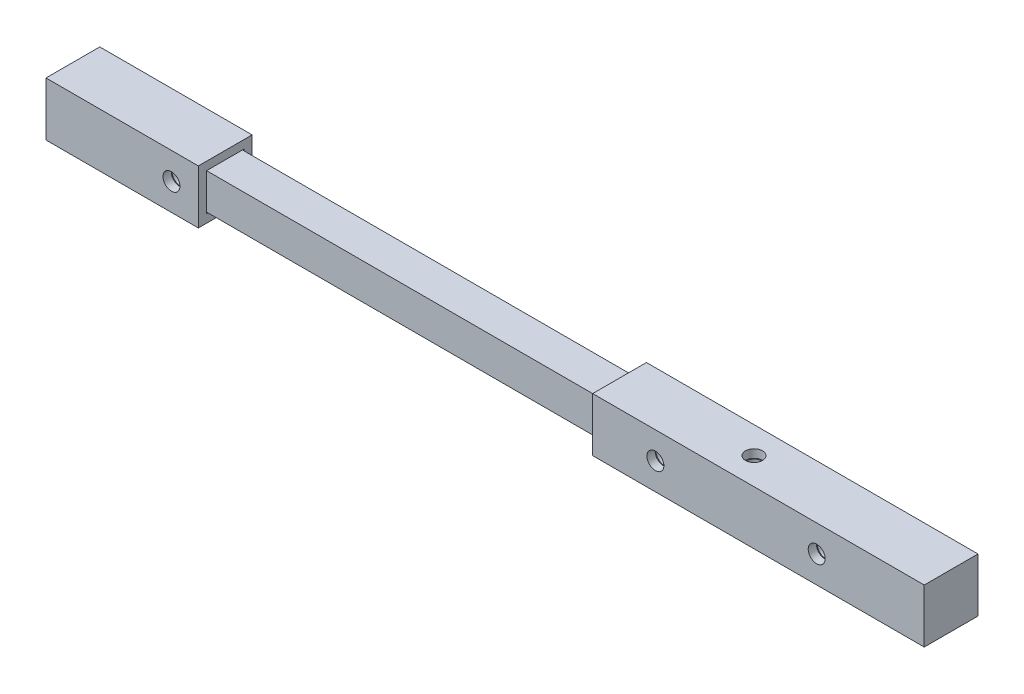
ISO-10303-21;
HEADER;
FILE_DESCRIPTION(('STEP AP214'),'2;1');
FILE_NAME('part.step','',(''),(''),'','','');
FILE_SCHEMA(('AUTOMOTIVE_DESIGN { 1 0 10303 214 1 1 1 1 }'));
ENDSEC;
DATA;
#1=APPLICATION_CONTEXT('core data for automotive mechanical design processes');
#2=APPLICATION_PROTOCOL_DEFINITION('international standard','automotive_design',2000,#1);
#3=PRODUCT_CONTEXT('',#1,'mechanical');
#4=PRODUCT('Part','Part','',(#3));
#5=PRODUCT_RELATED_PRODUCT_CATEGORY('part','',(#4));
#6=PRODUCT_DEFINITION_FORMATION('','',#4);
#7=PRODUCT_DEFINITION_CONTEXT('part definition',#1,'design');
#8=PRODUCT_DEFINITION('design','',#6,#7);
#9=PRODUCT_DEFINITION_SHAPE('','',#8);
#10=(LENGTH_UNIT() NAMED_UNIT(*) SI_UNIT(.MILLI.,.METRE.));
#11=(NAMED_UNIT(*) PLANE_ANGLE_UNIT() SI_UNIT($,.RADIAN.));
#12=(NAMED_UNIT(*) SI_UNIT($,.STERADIAN.) SOLID_ANGLE_UNIT());
#13=UNCERTAINTY_MEASURE_WITH_UNIT(LENGTH_MEASURE(1.E-05),#10,'distance_accuracy_value','');
#14=(GEOMETRIC_REPRESENTATION_CONTEXT(3) GLOBAL_UNCERTAINTY_ASSIGNED_CONTEXT((#13)) GLOBAL_UNIT_ASSIGNED_CONTEXT((#10,
#11,#12)) REPRESENTATION_CONTEXT('',''));
#15=CARTESIAN_POINT('',(0.,0.,0.));
#16=DIRECTION('',(0.,0.,1.));
#17=DIRECTION('',(1.,0.,0.));
#18=AXIS2_PLACEMENT_3D('',#15,#16,#17);
#19=CARTESIAN_POINT('',(25.4,-4.7625,-4.7625));
#20=DIRECTION('',(0.,-1.,0.));
#21=DIRECTION('',(0.,0.,-1.));
#22=AXIS2_PLACEMENT_3D('',#19,#20,#21);
#23=PLANE('',#22);
#24=DIRECTION('',(-1.,0.,0.));
#25=VECTOR('',#24,1.);
#26=CARTESIAN_POINT('',(25.4,-4.7625,4.7625));
#27=LINE('',#26,#25);
#28=CARTESIAN_POINT('',(25.4,-4.7625,4.7625));
#29=VERTEX_POINT('',#28);
#30=CARTESIAN_POINT('',(-1.5875,-4.7625,4.7625));
#31=VERTEX_POINT('',#30);
#32=EDGE_CURVE('E133',#29,#31,#27,.T.);
#33=ORIENTED_EDGE('',*,*,#32,.T.);
#34=DIRECTION('',(0.,0.,1.));
#35=VECTOR('',#34,1.);
#36=CARTESIAN_POINT('',(-1.5875,-4.7625,-4.7625));
#37=LINE('',#36,#35);
#38=CARTESIAN_POINT('',(-1.5875,-4.7625,-4.7625));
#39=VERTEX_POINT('',#38);
#40=EDGE_CURVE('E128',#39,#31,#37,.T.);
#41=ORIENTED_EDGE('',*,*,#40,.F.);
#42=DIRECTION('',(-1.,0.,0.));
#43=VECTOR('',#42,1.);
#44=CARTESIAN_POINT('',(25.4,-4.7625,-4.7625));
#45=LINE('',#44,#43);
#46=CARTESIAN_POINT('',(25.4,-4.7625,-4.7625));
#47=VERTEX_POINT('',#46);
#48=EDGE_CURVE('E12',#47,#39,#45,.T.);
#49=ORIENTED_EDGE('',*,*,#48,.F.);
#50=DIRECTION('',(0.,0.,1.));
#51=VECTOR('',#50,1.);
#52=CARTESIAN_POINT('',(25.4,-4.7625,-4.7625));
#53=LINE('',#52,#51);
#54=EDGE_CURVE('E172',#47,#29,#53,.T.);
#55=ORIENTED_EDGE('',*,*,#54,.T.);
#56=EDGE_LOOP('',(#33,#41,#49,#55));
#57=FACE_BOUND('',#56,.T.);
#58=ADVANCED_FACE('F59',(#57),#23,.T.);
#59=CARTESIAN_POINT('',(25.4,4.7625,-4.7625));
#60=DIRECTION('',(0.,0.,-1.));
#61=DIRECTION('',(-1.,0.,0.));
#62=AXIS2_PLACEMENT_3D('',#59,#60,#61);
#63=PLANE('',#62);
#64=CARTESIAN_POINT('',(20.6375,0.,-4.7625));
#65=DIRECTION('',(0.,0.,1.));
#66=DIRECTION('',(1.,0.,0.));
#67=AXIS2_PLACEMENT_3D('',#64,#65,#66);
#68=CIRCLE('',#67,1.5);
#69=CARTESIAN_POINT('',(22.1375,0.,-4.7625));
#70=VERTEX_POINT('',#69);
#71=EDGE_CURVE('E228',#70,#70,#68,.T.);
#72=ORIENTED_EDGE('',*,*,#71,.T.);
#73=EDGE_LOOP('',(#72));
#74=FACE_BOUND('',#73,.T.);
#75=ORIENTED_EDGE('',*,*,#48,.T.);
#76=DIRECTION('',(0.,-1.,0.));
#77=VECTOR('',#76,1.);
#78=CARTESIAN_POINT('',(-1.5875,4.7625,-4.7625));
#79=LINE('',#78,#77);
#80=CARTESIAN_POINT('',(-1.5875,4.7625,-4.7625));
#81=VERTEX_POINT('',#80);
#82=EDGE_CURVE('E127',#81,#39,#79,.T.);
#83=ORIENTED_EDGE('',*,*,#82,.F.);
#84=DIRECTION('',(-1.,0.,0.));
#85=VECTOR('',#84,1.);
#86=CARTESIAN_POINT('',(25.4,4.7625,-4.7625));
#87=LINE('',#86,#85);
#88=CARTESIAN_POINT('',(25.4,4.7625,-4.7625));
#89=VERTEX_POINT('',#88);
#90=EDGE_CURVE('E68',#89,#81,#87,.T.);
#91=ORIENTED_EDGE('',*,*,#90,.F.);
#92=DIRECTION('',(0.,-1.,0.));
#93=VECTOR('',#92,1.);
#94=CARTESIAN_POINT('',(25.4,4.7625,-4.7625));
#95=LINE('',#94,#93);
#96=EDGE_CURVE('E126',#89,#47,#95,.T.);
#97=ORIENTED_EDGE('',*,*,#96,.T.);
#98=EDGE_LOOP('',(#75,#83,#91,#97));
#99=FACE_BOUND('',#98,.T.);
#100=ADVANCED_FACE('F124',(#74,#99),#63,.T.);
#101=CARTESIAN_POINT('',(25.4,4.7625,4.7625));
#102=DIRECTION('',(0.,1.,0.));
#103=DIRECTION('',(0.,0.,1.));
#104=AXIS2_PLACEMENT_3D('',#101,#102,#103);
#105=PLANE('',#104);
#106=ORIENTED_EDGE('',*,*,#90,.T.);
#107=DIRECTION('',(0.,0.,-1.));
#108=VECTOR('',#107,1.);
#109=CARTESIAN_POINT('',(-1.5875,4.7625,4.7625));
#110=LINE('',#109,#108);
#111=CARTESIAN_POINT('',(-1.5875,4.7625,4.7625));
#112=VERTEX_POINT('',#111);
#113=EDGE_CURVE('E137',#112,#81,#110,.T.);
#114=ORIENTED_EDGE('',*,*,#113,.F.);
#115=DIRECTION('',(-1.,0.,0.));
#116=VECTOR('',#115,1.);
#117=CARTESIAN_POINT('',(25.4,4.7625,4.7625));
#118=LINE('',#117,#116);
#119=CARTESIAN_POINT('',(25.4,4.7625,4.7625));
#120=VERTEX_POINT('',#119);
#121=EDGE_CURVE('E195',#120,#112,#118,.T.);
#122=ORIENTED_EDGE('',*,*,#121,.F.);
#123=DIRECTION('',(0.,0.,-1.));
#124=VECTOR('',#123,1.);
#125=CARTESIAN_POINT('',(25.4,4.7625,4.7625));
#126=LINE('',#125,#124);
#127=EDGE_CURVE('E190',#120,#89,#126,.T.);
#128=ORIENTED_EDGE('',*,*,#127,.T.);
#129=EDGE_LOOP('',(#106,#114,#122,#128));
#130=FACE_BOUND('',#129,.T.);
#131=ADVANCED_FACE('F196',(#130),#105,.T.);
#132=CARTESIAN_POINT('',(25.4,-4.7625,4.7625));
#133=DIRECTION('',(0.,0.,1.));
#134=DIRECTION('',(1.,0.,0.));
#135=AXIS2_PLACEMENT_3D('',#132,#133,#134);
#136=PLANE('',#135);
#137=CARTESIAN_POINT('',(20.6375,0.,4.7625));
#138=DIRECTION('',(0.,0.,1.));
#139=DIRECTION('',(1.,0.,0.));
#140=AXIS2_PLACEMENT_3D('',#137,#138,#139);
#141=CIRCLE('',#140,1.5);
#142=CARTESIAN_POINT('',(22.1375,0.,4.7625));
#143=VERTEX_POINT('',#142);
#144=EDGE_CURVE('E226',#143,#143,#141,.T.);
#145=ORIENTED_EDGE('',*,*,#144,.F.);
#146=EDGE_LOOP('',(#145));
#147=FACE_BOUND('',#146,.T.);
#148=ORIENTED_EDGE('',*,*,#121,.T.);
#149=DIRECTION('',(0.,1.,0.));
#150=VECTOR('',#149,1.);
#151=CARTESIAN_POINT('',(-1.5875,-4.7625,4.7625));
#152=LINE('',#151,#150);
#153=EDGE_CURVE('E132',#31,#112,#152,.T.);
#154=ORIENTED_EDGE('',*,*,#153,.F.);
#155=ORIENTED_EDGE('',*,*,#32,.F.);
#156=DIRECTION('',(0.,1.,0.));
#157=VECTOR('',#156,1.);
#158=CARTESIAN_POINT('',(25.4,-4.7625,4.7625));
#159=LINE('',#158,#157);
#160=EDGE_CURVE('E184',#29,#120,#159,.T.);
#161=ORIENTED_EDGE('',*,*,#160,.T.);
#162=EDGE_LOOP('',(#148,#154,#155,#161));
#163=FACE_BOUND('',#162,.T.);
#164=ADVANCED_FACE('F194',(#147,#163),#136,.T.);
#165=CARTESIAN_POINT('',(25.4,0.,0.));
#166=DIRECTION('',(-1.,0.,0.));
#167=DIRECTION('',(0.,0.,1.));
#168=AXIS2_PLACEMENT_3D('',#165,#166,#167);
#169=PLANE('',#168);
#170=DIRECTION('',(0.,1.,0.));
#171=VECTOR('',#170,1.);
#172=CARTESIAN_POINT('',(25.4,3.302,3.302));
#173=LINE('',#172,#171);
#174=CARTESIAN_POINT('',(25.4,-3.302,3.302));
#175=VERTEX_POINT('',#174);
#176=CARTESIAN_POINT('',(25.4,3.302,3.302));
#177=VERTEX_POINT('',#176);
#178=EDGE_CURVE('E158',#175,#177,#173,.T.);
#179=ORIENTED_EDGE('',*,*,#178,.T.);
#180=DIRECTION('',(0.,0.,-1.));
#181=VECTOR('',#180,1.);
#182=CARTESIAN_POINT('',(25.4,3.302,-3.302));
#183=LINE('',#182,#181);
#184=CARTESIAN_POINT('',(25.4,3.302,-3.302));
#185=VERTEX_POINT('',#184);
#186=EDGE_CURVE('E147',#177,#185,#183,.T.);
#187=ORIENTED_EDGE('',*,*,#186,.T.);
#188=DIRECTION('',(0.,-1.,0.));
#189=VECTOR('',#188,1.);
#190=CARTESIAN_POINT('',(25.4,-3.302,-3.302));
#191=LINE('',#190,#189);
#192=CARTESIAN_POINT('',(25.4,-3.302,-3.302));
#193=VERTEX_POINT('',#192);
#194=EDGE_CURVE('E153',#185,#193,#191,.T.);
#195=ORIENTED_EDGE('',*,*,#194,.T.);
#196=DIRECTION('',(0.,0.,1.));
#197=VECTOR('',#196,1.);
#198=CARTESIAN_POINT('',(25.4,-3.302,3.302));
#199=LINE('',#198,#197);
#200=EDGE_CURVE('E74',#193,#175,#199,.T.);
#201=ORIENTED_EDGE('',*,*,#200,.T.);
#202=EDGE_LOOP('',(#179,#187,#195,#201));
#203=FACE_BOUND('',#202,.T.);
#204=ORIENTED_EDGE('',*,*,#54,.F.);
#205=ORIENTED_EDGE('',*,*,#96,.F.);
#206=ORIENTED_EDGE('',*,*,#127,.F.);
#207=ORIENTED_EDGE('',*,*,#160,.F.);
#208=EDGE_LOOP('',(#204,#205,#206,#207));
#209=FACE_BOUND('',#208,.T.);
#210=ADVANCED_FACE('F199',(#203,#209),#169,.F.);
#211=CARTESIAN_POINT('',(25.4,3.302,-3.302));
#212=DIRECTION('',(0.,1.,0.));
#213=DIRECTION('',(0.,0.,1.));
#214=AXIS2_PLACEMENT_3D('',#211,#212,#213);
#215=PLANE('',#214);
#216=DIRECTION('',(0.,0.,-1.));
#217=VECTOR('',#216,1.);
#218=CARTESIAN_POINT('',(0.,3.302,-3.302));
#219=LINE('',#218,#217);
#220=CARTESIAN_POINT('',(0.,3.302,3.302));
#221=VERTEX_POINT('',#220);
#222=CARTESIAN_POINT('',(0.,3.302,-3.302));
#223=VERTEX_POINT('',#222);
#224=EDGE_CURVE('E149',#221,#223,#219,.T.);
#225=ORIENTED_EDGE('',*,*,#224,.T.);
#226=DIRECTION('',(-1.,0.,0.));
#227=VECTOR('',#226,1.);
#228=CARTESIAN_POINT('',(25.4,3.302,-3.302));
#229=LINE('',#228,#227);
#230=EDGE_CURVE('E161',#185,#223,#229,.T.);
#231=ORIENTED_EDGE('',*,*,#230,.F.);
#232=ORIENTED_EDGE('',*,*,#186,.F.);
#233=DIRECTION('',(-1.,0.,0.));
#234=VECTOR('',#233,1.);
#235=CARTESIAN_POINT('',(25.4,3.302,3.302));
#236=LINE('',#235,#234);
#237=EDGE_CURVE('E175',#177,#221,#236,.T.);
#238=ORIENTED_EDGE('',*,*,#237,.T.);
#239=EDGE_LOOP('',(#225,#231,#232,#238));
#240=FACE_BOUND('',#239,.T.);
#241=ADVANCED_FACE('F205',(#240),#215,.F.);
#242=CARTESIAN_POINT('',(25.4,3.302,3.302));
#243=DIRECTION('',(0.,0.,1.));
#244=DIRECTION('',(1.,0.,0.));
#245=AXIS2_PLACEMENT_3D('',#242,#243,#244);
#246=PLANE('',#245);
#247=CARTESIAN_POINT('',(20.6375,0.,3.302));
#248=DIRECTION('',(0.,0.,1.));
#249=DIRECTION('',(1.,0.,0.));
#250=AXIS2_PLACEMENT_3D('',#247,#248,#249);
#251=CIRCLE('',#250,1.5);
#252=CARTESIAN_POINT('',(22.1375,0.,3.302));
#253=VERTEX_POINT('',#252);
#254=EDGE_CURVE('E143',#253,#253,#251,.T.);
#255=ORIENTED_EDGE('',*,*,#254,.T.);
#256=EDGE_LOOP('',(#255));
#257=FACE_BOUND('',#256,.T.);
#258=DIRECTION('',(0.,1.,0.));
#259=VECTOR('',#258,1.);
#260=CARTESIAN_POINT('',(0.,3.302,3.302));
#261=LINE('',#260,#259);
#262=CARTESIAN_POINT('',(0.,-3.302,3.302));
#263=VERTEX_POINT('',#262);
#264=EDGE_CURVE('E152',#263,#221,#261,.T.);
#265=ORIENTED_EDGE('',*,*,#264,.T.);
#266=ORIENTED_EDGE('',*,*,#237,.F.);
#267=ORIENTED_EDGE('',*,*,#178,.F.);
#268=DIRECTION('',(-1.,0.,0.));
#269=VECTOR('',#268,1.);
#270=CARTESIAN_POINT('',(25.4,-3.302,3.302));
#271=LINE('',#270,#269);
#272=EDGE_CURVE('E178',#175,#263,#271,.T.);
#273=ORIENTED_EDGE('',*,*,#272,.T.);
#274=EDGE_LOOP('',(#265,#266,#267,#273));
#275=FACE_BOUND('',#274,.T.);
#276=ADVANCED_FACE('F207',(#257,#275),#246,.F.);
#277=CARTESIAN_POINT('',(25.4,-3.302,3.302));
#278=DIRECTION('',(0.,-1.,0.));
#279=DIRECTION('',(0.,0.,-1.));
#280=AXIS2_PLACEMENT_3D('',#277,#278,#279);
#281=PLANE('',#280);
#282=DIRECTION('',(0.,0.,1.));
#283=VECTOR('',#282,1.);
#284=CARTESIAN_POINT('',(0.,-3.302,3.302));
#285=LINE('',#284,#283);
#286=CARTESIAN_POINT('',(0.,-3.302,-3.302));
#287=VERTEX_POINT('',#286);
#288=EDGE_CURVE('E170',#287,#263,#285,.T.);
#289=ORIENTED_EDGE('',*,*,#288,.T.);
#290=ORIENTED_EDGE('',*,*,#272,.F.);
#291=ORIENTED_EDGE('',*,*,#200,.F.);
#292=DIRECTION('',(-1.,0.,0.));
#293=VECTOR('',#292,1.);
#294=CARTESIAN_POINT('',(25.4,-3.302,-3.302));
#295=LINE('',#294,#293);
#296=EDGE_CURVE('E179',#193,#287,#295,.T.);
#297=ORIENTED_EDGE('',*,*,#296,.T.);
#298=EDGE_LOOP('',(#289,#290,#291,#297));
#299=FACE_BOUND('',#298,.T.);
#300=ADVANCED_FACE('F241',(#299),#281,.F.);
#301=CARTESIAN_POINT('',(25.4,-3.302,-3.302));
#302=DIRECTION('',(0.,0.,-1.));
#303=DIRECTION('',(-1.,0.,0.));
#304=AXIS2_PLACEMENT_3D('',#301,#302,#303);
#305=PLANE('',#304);
#306=CARTESIAN_POINT('',(20.6375,0.,-3.302));
#307=DIRECTION('',(0.,0.,-1.));
#308=DIRECTION('',(-1.,0.,0.));
#309=AXIS2_PLACEMENT_3D('',#306,#307,#308);
#310=CIRCLE('',#309,1.5);
#311=CARTESIAN_POINT('',(19.1375,0.,-3.302));
#312=VERTEX_POINT('',#311);
#313=EDGE_CURVE('E63',#312,#312,#310,.T.);
#314=ORIENTED_EDGE('',*,*,#313,.T.);
#315=EDGE_LOOP('',(#314));
#316=FACE_BOUND('',#315,.T.);
#317=DIRECTION('',(0.,-1.,0.));
#318=VECTOR('',#317,1.);
#319=CARTESIAN_POINT('',(0.,-3.302,-3.302));
#320=LINE('',#319,#318);
#321=EDGE_CURVE('E163',#223,#287,#320,.T.);
#322=ORIENTED_EDGE('',*,*,#321,.T.);
#323=ORIENTED_EDGE('',*,*,#296,.F.);
#324=ORIENTED_EDGE('',*,*,#194,.F.);
#325=ORIENTED_EDGE('',*,*,#230,.T.);
#326=EDGE_LOOP('',(#322,#323,#324,#325));
#327=FACE_BOUND('',#326,.T.);
#328=ADVANCED_FACE('F253',(#316,#327),#305,.F.);
#329=CARTESIAN_POINT('',(0.,0.,0.));
#330=DIRECTION('',(-1.,0.,0.));
#331=DIRECTION('',(0.,0.,1.));
#332=AXIS2_PLACEMENT_3D('',#329,#330,#331);
#333=PLANE('',#332);
#334=ORIENTED_EDGE('',*,*,#224,.F.);
#335=ORIENTED_EDGE('',*,*,#264,.F.);
#336=ORIENTED_EDGE('',*,*,#288,.F.);
#337=ORIENTED_EDGE('',*,*,#321,.F.);
#338=EDGE_LOOP('',(#334,#335,#336,#337));
#339=FACE_BOUND('',#338,.T.);
#340=ADVANCED_FACE('F246',(#339),#333,.F.);
#341=CARTESIAN_POINT('',(-1.5875,0.,0.));
#342=DIRECTION('',(-1.,0.,0.));
#343=DIRECTION('',(0.,0.,1.));
#344=AXIS2_PLACEMENT_3D('',#341,#342,#343);
#345=PLANE('',#344);
#346=ORIENTED_EDGE('',*,*,#82,.T.);
#347=ORIENTED_EDGE('',*,*,#40,.T.);
#348=ORIENTED_EDGE('',*,*,#153,.T.);
#349=ORIENTED_EDGE('',*,*,#113,.T.);
#350=EDGE_LOOP('',(#346,#347,#348,#349));
#351=FACE_BOUND('',#350,.T.);
#352=ADVANCED_FACE('F136',(#351),#345,.T.);
#353=CARTESIAN_POINT('',(20.6375,0.,-4.7625));
#354=DIRECTION('',(0.,0.,1.));
#355=DIRECTION('',(1.,0.,0.));
#356=AXIS2_PLACEMENT_3D('',#353,#354,#355);
#357=CYLINDRICAL_SURFACE('',#356,1.5);
#358=ORIENTED_EDGE('',*,*,#71,.F.);
#359=EDGE_LOOP('',(#358));
#360=FACE_BOUND('',#359,.T.);
#361=ORIENTED_EDGE('',*,*,#313,.F.);
#362=EDGE_LOOP('',(#361));
#363=FACE_BOUND('',#362,.T.);
#364=ADVANCED_FACE('F240',(#360,#363),#357,.F.);
#365=ORIENTED_EDGE('',*,*,#144,.T.);
#366=EDGE_LOOP('',(#365));
#367=FACE_BOUND('',#366,.T.);
#368=ORIENTED_EDGE('',*,*,#254,.F.);
#369=EDGE_LOOP('',(#368));
#370=FACE_BOUND('',#369,.T.);
#371=ADVANCED_FACE('F234',(#367,#370),#357,.F.);
#372=CLOSED_SHELL('',(#58,#100,#131,#164,#210,#241,#276,#300,#328,#340,#352,#364,#371));
#373=MANIFOLD_SOLID_BREP('B2_NOT_SHOWN',#372);
#374=CARTESIAN_POINT('',(95.25,-4.7625,4.7625));
#375=DIRECTION('',(0.,0.,1.));
#376=DIRECTION('',(1.,0.,0.));
#377=AXIS2_PLACEMENT_3D('',#374,#375,#376);
#378=PLANE('',#377);
#379=CARTESIAN_POINT('',(134.9375,0.,4.7625));
#380=DIRECTION('',(0.,0.,1.));
#381=DIRECTION('',(1.,0.,0.));
#382=AXIS2_PLACEMENT_3D('',#379,#380,#381);
#383=CIRCLE('',#382,1.5);
#384=CARTESIAN_POINT('',(136.4375,0.,4.7625));
#385=VERTEX_POINT('',#384);
#386=EDGE_CURVE('E542',#385,#385,#383,.T.);
#387=ORIENTED_EDGE('',*,*,#386,.F.);
#388=EDGE_LOOP('',(#387));
#389=FACE_BOUND('',#388,.T.);
#390=CARTESIAN_POINT('',(106.3625,0.,4.7625));
#391=DIRECTION('',(0.,0.,1.));
#392=DIRECTION('',(1.,0.,0.));
#393=AXIS2_PLACEMENT_3D('',#390,#391,#392);
#394=CIRCLE('',#393,1.5);
#395=CARTESIAN_POINT('',(107.8625,0.,4.7625));
#396=VERTEX_POINT('',#395);
#397=EDGE_CURVE('E541',#396,#396,#394,.T.);
#398=ORIENTED_EDGE('',*,*,#397,.F.);
#399=EDGE_LOOP('',(#398));
#400=FACE_BOUND('',#399,.T.);
#401=DIRECTION('',(1.,0.,0.));
#402=VECTOR('',#401,1.);
#403=CARTESIAN_POINT('',(95.25,-4.7625,4.7625));
#404=LINE('',#403,#402);
#405=CARTESIAN_POINT('',(95.25,-4.7625,4.7625));
#406=VERTEX_POINT('',#405);
#407=CARTESIAN_POINT('',(153.9875,-4.7625,4.7625));
#408=VERTEX_POINT('',#407);
#409=EDGE_CURVE('E444',#406,#408,#404,.T.);
#410=ORIENTED_EDGE('',*,*,#409,.T.);
#411=DIRECTION('',(0.,-1.,0.));
#412=VECTOR('',#411,1.);
#413=CARTESIAN_POINT('',(153.9875,4.7625,4.7625));
#414=LINE('',#413,#412);
#415=CARTESIAN_POINT('',(153.9875,4.7625,4.7625));
#416=VERTEX_POINT('',#415);
#417=EDGE_CURVE('E445',#416,#408,#414,.T.);
#418=ORIENTED_EDGE('',*,*,#417,.F.);
#419=DIRECTION('',(1.,0.,0.));
#420=VECTOR('',#419,1.);
#421=CARTESIAN_POINT('',(95.25,4.7625,4.7625));
#422=LINE('',#421,#420);
#423=CARTESIAN_POINT('',(95.25,4.7625,4.7625));
#424=VERTEX_POINT('',#423);
#425=EDGE_CURVE('E57',#424,#416,#422,.T.);
#426=ORIENTED_EDGE('',*,*,#425,.F.);
#427=DIRECTION('',(0.,-1.,0.));
#428=VECTOR('',#427,1.);
#429=CARTESIAN_POINT('',(95.25,-4.7625,4.7625));
#430=LINE('',#429,#428);
#431=EDGE_CURVE('E500',#424,#406,#430,.T.);
#432=ORIENTED_EDGE('',*,*,#431,.T.);
#433=EDGE_LOOP('',(#410,#418,#426,#432));
#434=FACE_BOUND('',#433,.T.);
#435=ADVANCED_FACE('F359',(#389,#400,#434),#378,.T.);
#436=CARTESIAN_POINT('',(95.25,4.7625,-4.7625));
#437=DIRECTION('',(0.,1.,0.));
#438=DIRECTION('',(0.,0.,1.));
#439=AXIS2_PLACEMENT_3D('',#436,#437,#438);
#440=PLANE('',#439);
#441=CARTESIAN_POINT('',(119.0625,4.7625,0.));
#442=DIRECTION('',(0.,1.,0.));
#443=DIRECTION('',(0.,0.,1.));
#444=AXIS2_PLACEMENT_3D('',#441,#442,#443);
#445=CIRCLE('',#444,1.5);
#446=CARTESIAN_POINT('',(119.0625,4.7625,1.5));
#447=VERTEX_POINT('',#446);
#448=EDGE_CURVE('E565',#447,#447,#445,.T.);
#449=ORIENTED_EDGE('',*,*,#448,.F.);
#450=EDGE_LOOP('',(#449));
#451=FACE_BOUND('',#450,.T.);
#452=ORIENTED_EDGE('',*,*,#425,.T.);
#453=DIRECTION('',(0.,0.,1.));
#454=VECTOR('',#453,1.);
#455=CARTESIAN_POINT('',(153.9875,4.7625,-4.7625));
#456=LINE('',#455,#454);
#457=CARTESIAN_POINT('',(153.9875,4.7625,-4.7625));
#458=VERTEX_POINT('',#457);
#459=EDGE_CURVE('E437',#458,#416,#456,.T.);
#460=ORIENTED_EDGE('',*,*,#459,.F.);
#461=DIRECTION('',(1.,0.,0.));
#462=VECTOR('',#461,1.);
#463=CARTESIAN_POINT('',(95.25,4.7625,-4.7625));
#464=LINE('',#463,#462);
#465=CARTESIAN_POINT('',(95.25,4.7625,-4.7625));
#466=VERTEX_POINT('',#465);
#467=EDGE_CURVE('E366',#466,#458,#464,.T.);
#468=ORIENTED_EDGE('',*,*,#467,.F.);
#469=DIRECTION('',(0.,0.,1.));
#470=VECTOR('',#469,1.);
#471=CARTESIAN_POINT('',(95.25,4.7625,-4.7625));
#472=LINE('',#471,#470);
#473=EDGE_CURVE('E439',#466,#424,#472,.T.);
#474=ORIENTED_EDGE('',*,*,#473,.T.);
#475=EDGE_LOOP('',(#452,#460,#468,#474));
#476=FACE_BOUND('',#475,.T.);
#477=ADVANCED_FACE('F436',(#451,#476),#440,.T.);
#478=CARTESIAN_POINT('',(95.25,-4.7625,-4.7625));
#479=DIRECTION('',(0.,0.,-1.));
#480=DIRECTION('',(-1.,0.,0.));
#481=AXIS2_PLACEMENT_3D('',#478,#479,#480);
#482=PLANE('',#481);
#483=CARTESIAN_POINT('',(134.9375,0.,-4.7625));
#484=DIRECTION('',(0.,0.,1.));
#485=DIRECTION('',(1.,0.,0.));
#486=AXIS2_PLACEMENT_3D('',#483,#484,#485);
#487=CIRCLE('',#486,1.5);
#488=CARTESIAN_POINT('',(136.4375,0.,-4.7625));
#489=VERTEX_POINT('',#488);
#490=EDGE_CURVE('E533',#489,#489,#487,.T.);
#491=ORIENTED_EDGE('',*,*,#490,.T.);
#492=EDGE_LOOP('',(#491));
#493=FACE_BOUND('',#492,.T.);
#494=CARTESIAN_POINT('',(106.3625,0.,-4.7625));
#495=DIRECTION('',(0.,0.,1.));
#496=DIRECTION('',(1.,0.,0.));
#497=AXIS2_PLACEMENT_3D('',#494,#495,#496);
#498=CIRCLE('',#497,1.5);
#499=CARTESIAN_POINT('',(107.8625,0.,-4.7625));
#500=VERTEX_POINT('',#499);
#501=EDGE_CURVE('E544',#500,#500,#498,.T.);
#502=ORIENTED_EDGE('',*,*,#501,.T.);
#503=EDGE_LOOP('',(#502));
#504=FACE_BOUND('',#503,.T.);
#505=ORIENTED_EDGE('',*,*,#467,.T.);
#506=DIRECTION('',(0.,1.,0.));
#507=VECTOR('',#506,1.);
#508=CARTESIAN_POINT('',(153.9875,-4.7625,-4.7625));
#509=LINE('',#508,#507);
#510=CARTESIAN_POINT('',(153.9875,-4.7625,-4.7625));
#511=VERTEX_POINT('',#510);
#512=EDGE_CURVE('E451',#511,#458,#509,.T.);
#513=ORIENTED_EDGE('',*,*,#512,.F.);
#514=DIRECTION('',(1.,0.,0.));
#515=VECTOR('',#514,1.);
#516=CARTESIAN_POINT('',(95.25,-4.7625,-4.7625));
#517=LINE('',#516,#515);
#518=CARTESIAN_POINT('',(95.25,-4.7625,-4.7625));
#519=VERTEX_POINT('',#518);
#520=EDGE_CURVE('E525',#519,#511,#517,.T.);
#521=ORIENTED_EDGE('',*,*,#520,.F.);
#522=DIRECTION('',(0.,1.,0.));
#523=VECTOR('',#522,1.);
#524=CARTESIAN_POINT('',(95.25,-4.7625,-4.7625));
#525=LINE('',#524,#523);
#526=EDGE_CURVE('E514',#519,#466,#525,.T.);
#527=ORIENTED_EDGE('',*,*,#526,.T.);
#528=EDGE_LOOP('',(#505,#513,#521,#527));
#529=FACE_BOUND('',#528,.T.);
#530=ADVANCED_FACE('F575',(#493,#504,#529),#482,.T.);
#531=CARTESIAN_POINT('',(95.25,-4.7625,-4.7625));
#532=DIRECTION('',(0.,-1.,0.));
#533=DIRECTION('',(0.,0.,-1.));
#534=AXIS2_PLACEMENT_3D('',#531,#532,#533);
#535=PLANE('',#534);
#536=CARTESIAN_POINT('',(119.0625,-4.7625,0.));
#537=DIRECTION('',(0.,1.,0.));
#538=DIRECTION('',(0.,0.,1.));
#539=AXIS2_PLACEMENT_3D('',#536,#537,#538);
#540=CIRCLE('',#539,1.5);
#541=CARTESIAN_POINT('',(119.0625,-4.7625,1.5));
#542=VERTEX_POINT('',#541);
#543=EDGE_CURVE('E556',#542,#542,#540,.T.);
#544=ORIENTED_EDGE('',*,*,#543,.T.);
#545=EDGE_LOOP('',(#544));
#546=FACE_BOUND('',#545,.T.);
#547=ORIENTED_EDGE('',*,*,#520,.T.);
#548=DIRECTION('',(0.,0.,-1.));
#549=VECTOR('',#548,1.);
#550=CARTESIAN_POINT('',(153.9875,-4.7625,4.7625));
#551=LINE('',#550,#549);
#552=EDGE_CURVE('E446',#408,#511,#551,.T.);
#553=ORIENTED_EDGE('',*,*,#552,.F.);
#554=ORIENTED_EDGE('',*,*,#409,.F.);
#555=DIRECTION('',(0.,0.,-1.));
#556=VECTOR('',#555,1.);
#557=CARTESIAN_POINT('',(95.25,-4.7625,-4.7625));
#558=LINE('',#557,#556);
#559=EDGE_CURVE('E507',#406,#519,#558,.T.);
#560=ORIENTED_EDGE('',*,*,#559,.T.);
#561=EDGE_LOOP('',(#547,#553,#554,#560));
#562=FACE_BOUND('',#561,.T.);
#563=ADVANCED_FACE('F578',(#546,#562),#535,.T.);
#564=CARTESIAN_POINT('',(95.25,0.,0.));
#565=DIRECTION('',(1.,0.,0.));
#566=DIRECTION('',(0.,0.,-1.));
#567=AXIS2_PLACEMENT_3D('',#564,#565,#566);
#568=PLANE('',#567);
#569=DIRECTION('',(0.,-1.,0.));
#570=VECTOR('',#569,1.);
#571=CARTESIAN_POINT('',(95.25,3.302,3.302));
#572=LINE('',#571,#570);
#573=CARTESIAN_POINT('',(95.25,3.302,3.302));
#574=VERTEX_POINT('',#573);
#575=CARTESIAN_POINT('',(95.25,-3.302,3.302));
#576=VERTEX_POINT('',#575);
#577=EDGE_CURVE('E478',#574,#576,#572,.T.);
#578=ORIENTED_EDGE('',*,*,#577,.T.);
#579=DIRECTION('',(0.,0.,-1.));
#580=VECTOR('',#579,1.);
#581=CARTESIAN_POINT('',(95.25,-3.302,3.302));
#582=LINE('',#581,#580);
#583=CARTESIAN_POINT('',(95.25,-3.302,-3.302));
#584=VERTEX_POINT('',#583);
#585=EDGE_CURVE('E462',#576,#584,#582,.T.);
#586=ORIENTED_EDGE('',*,*,#585,.T.);
#587=DIRECTION('',(0.,1.,0.));
#588=VECTOR('',#587,1.);
#589=CARTESIAN_POINT('',(95.25,-3.302,-3.302));
#590=LINE('',#589,#588);
#591=CARTESIAN_POINT('',(95.25,3.302,-3.302));
#592=VERTEX_POINT('',#591);
#593=EDGE_CURVE('E469',#584,#592,#590,.T.);
#594=ORIENTED_EDGE('',*,*,#593,.T.);
#595=DIRECTION('',(0.,0.,1.));
#596=VECTOR('',#595,1.);
#597=CARTESIAN_POINT('',(95.25,3.302,-3.302));
#598=LINE('',#597,#596);
#599=EDGE_CURVE('E377',#592,#574,#598,.T.);
#600=ORIENTED_EDGE('',*,*,#599,.T.);
#601=EDGE_LOOP('',(#578,#586,#594,#600));
#602=FACE_BOUND('',#601,.T.);
#603=ORIENTED_EDGE('',*,*,#431,.F.);
#604=ORIENTED_EDGE('',*,*,#473,.F.);
#605=ORIENTED_EDGE('',*,*,#526,.F.);
#606=ORIENTED_EDGE('',*,*,#559,.F.);
#607=EDGE_LOOP('',(#603,#604,#605,#606));
#608=FACE_BOUND('',#607,.T.);
#609=ADVANCED_FACE('F582',(#602,#608),#568,.F.);
#610=CARTESIAN_POINT('',(95.25,-3.302,3.302));
#611=DIRECTION('',(0.,-1.,0.));
#612=DIRECTION('',(0.,0.,-1.));
#613=AXIS2_PLACEMENT_3D('',#610,#611,#612);
#614=PLANE('',#613);
#615=CARTESIAN_POINT('',(119.0625,-3.302,0.));
#616=DIRECTION('',(0.,-1.,0.));
#617=DIRECTION('',(0.,0.,-1.));
#618=AXIS2_PLACEMENT_3D('',#615,#616,#617);
#619=CIRCLE('',#618,1.5);
#620=CARTESIAN_POINT('',(119.0625,-3.302,-1.5));
#621=VERTEX_POINT('',#620);
#622=EDGE_CURVE('E548',#621,#621,#619,.T.);
#623=ORIENTED_EDGE('',*,*,#622,.T.);
#624=EDGE_LOOP('',(#623));
#625=FACE_BOUND('',#624,.T.);
#626=DIRECTION('',(0.,0.,-1.));
#627=VECTOR('',#626,1.);
#628=CARTESIAN_POINT('',(152.4,-3.302,3.302));
#629=LINE('',#628,#627);
#630=CARTESIAN_POINT('',(152.4,-3.302,3.302));
#631=VERTEX_POINT('',#630);
#632=CARTESIAN_POINT('',(152.4,-3.302,-3.302));
#633=VERTEX_POINT('',#632);
#634=EDGE_CURVE('E464',#631,#633,#629,.T.);
#635=ORIENTED_EDGE('',*,*,#634,.T.);
#636=DIRECTION('',(1.,0.,0.));
#637=VECTOR('',#636,1.);
#638=CARTESIAN_POINT('',(95.25,-3.302,-3.302));
#639=LINE('',#638,#637);
#640=EDGE_CURVE('E477',#584,#633,#639,.T.);
#641=ORIENTED_EDGE('',*,*,#640,.F.);
#642=ORIENTED_EDGE('',*,*,#585,.F.);
#643=DIRECTION('',(1.,0.,0.));
#644=VECTOR('',#643,1.);
#645=CARTESIAN_POINT('',(95.25,-3.302,3.302));
#646=LINE('',#645,#644);
#647=EDGE_CURVE('E492',#576,#631,#646,.T.);
#648=ORIENTED_EDGE('',*,*,#647,.T.);
#649=EDGE_LOOP('',(#635,#641,#642,#648));
#650=FACE_BOUND('',#649,.T.);
#651=ADVANCED_FACE('F589',(#625,#650),#614,.F.);
#652=CARTESIAN_POINT('',(95.25,3.302,3.302));
#653=DIRECTION('',(0.,0.,1.));
#654=DIRECTION('',(1.,0.,0.));
#655=AXIS2_PLACEMENT_3D('',#652,#653,#654);
#656=PLANE('',#655);
#657=CARTESIAN_POINT('',(134.9375,0.,3.302));
#658=DIRECTION('',(0.,0.,1.));
#659=DIRECTION('',(1.,0.,0.));
#660=AXIS2_PLACEMENT_3D('',#657,#658,#659);
#661=CIRCLE('',#660,1.5);
#662=CARTESIAN_POINT('',(136.4375,0.,3.302));
#663=VERTEX_POINT('',#662);
#664=EDGE_CURVE('E454',#663,#663,#661,.T.);
#665=ORIENTED_EDGE('',*,*,#664,.T.);
#666=EDGE_LOOP('',(#665));
#667=FACE_BOUND('',#666,.T.);
#668=CARTESIAN_POINT('',(106.3625,0.,3.302));
#669=DIRECTION('',(0.,0.,1.));
#670=DIRECTION('',(1.,0.,0.));
#671=AXIS2_PLACEMENT_3D('',#668,#669,#670);
#672=CIRCLE('',#671,1.5);
#673=CARTESIAN_POINT('',(107.8625,0.,3.302));
#674=VERTEX_POINT('',#673);
#675=EDGE_CURVE('E529',#674,#674,#672,.T.);
#676=ORIENTED_EDGE('',*,*,#675,.T.);
#677=EDGE_LOOP('',(#676));
#678=FACE_BOUND('',#677,.T.);
#679=DIRECTION('',(0.,-1.,0.));
#680=VECTOR('',#679,1.);
#681=CARTESIAN_POINT('',(152.4,3.302,3.302));
#682=LINE('',#681,#680);
#683=CARTESIAN_POINT('',(152.4,3.302,3.302));
#684=VERTEX_POINT('',#683);
#685=EDGE_CURVE('E467',#684,#631,#682,.T.);
#686=ORIENTED_EDGE('',*,*,#685,.T.);
#687=ORIENTED_EDGE('',*,*,#647,.F.);
#688=ORIENTED_EDGE('',*,*,#577,.F.);
#689=DIRECTION('',(1.,0.,0.));
#690=VECTOR('',#689,1.);
#691=CARTESIAN_POINT('',(95.25,3.302,3.302));
#692=LINE('',#691,#690);
#693=EDGE_CURVE('E499',#574,#684,#692,.T.);
#694=ORIENTED_EDGE('',*,*,#693,.T.);
#695=EDGE_LOOP('',(#686,#687,#688,#694));
#696=FACE_BOUND('',#695,.T.);
#697=ADVANCED_FACE('F604',(#667,#678,#696),#656,.F.);
#698=CARTESIAN_POINT('',(95.25,3.302,-3.302));
#699=DIRECTION('',(0.,1.,0.));
#700=DIRECTION('',(0.,0.,1.));
#701=AXIS2_PLACEMENT_3D('',#698,#699,#700);
#702=PLANE('',#701);
#703=CARTESIAN_POINT('',(119.0625,3.302,0.));
#704=DIRECTION('',(0.,1.,0.));
#705=DIRECTION('',(0.,0.,1.));
#706=AXIS2_PLACEMENT_3D('',#703,#704,#705);
#707=CIRCLE('',#706,1.5);
#708=CARTESIAN_POINT('',(119.0625,3.302,1.5));
#709=VERTEX_POINT('',#708);
#710=EDGE_CURVE('E362',#709,#709,#707,.T.);
#711=ORIENTED_EDGE('',*,*,#710,.T.);
#712=EDGE_LOOP('',(#711));
#713=FACE_BOUND('',#712,.T.);
#714=DIRECTION('',(0.,0.,1.));
#715=VECTOR('',#714,1.);
#716=CARTESIAN_POINT('',(152.4,3.302,-3.302));
#717=LINE('',#716,#715);
#718=CARTESIAN_POINT('',(152.4,3.302,-3.302));
#719=VERTEX_POINT('',#718);
#720=EDGE_CURVE('E490',#719,#684,#717,.T.);
#721=ORIENTED_EDGE('',*,*,#720,.T.);
#722=ORIENTED_EDGE('',*,*,#693,.F.);
#723=ORIENTED_EDGE('',*,*,#599,.F.);
#724=DIRECTION('',(1.,0.,0.));
#725=VECTOR('',#724,1.);
#726=CARTESIAN_POINT('',(95.25,3.302,-3.302));
#727=LINE('',#726,#725);
#728=EDGE_CURVE('E505',#592,#719,#727,.T.);
#729=ORIENTED_EDGE('',*,*,#728,.T.);
#730=EDGE_LOOP('',(#721,#722,#723,#729));
#731=FACE_BOUND('',#730,.T.);
#732=ADVANCED_FACE('F614',(#713,#731),#702,.F.);
#733=CARTESIAN_POINT('',(95.25,-3.302,-3.302));
#734=DIRECTION('',(0.,0.,-1.));
#735=DIRECTION('',(-1.,0.,0.));
#736=AXIS2_PLACEMENT_3D('',#733,#734,#735);
#737=PLANE('',#736);
#738=CARTESIAN_POINT('',(134.9375,0.,-3.302));
#739=DIRECTION('',(0.,0.,-1.));
#740=DIRECTION('',(-1.,0.,0.));
#741=AXIS2_PLACEMENT_3D('',#738,#739,#740);
#742=CIRCLE('',#741,1.5);
#743=CARTESIAN_POINT('',(133.4375,0.,-3.302));
#744=VERTEX_POINT('',#743);
#745=EDGE_CURVE('E460',#744,#744,#742,.T.);
#746=ORIENTED_EDGE('',*,*,#745,.T.);
#747=EDGE_LOOP('',(#746));
#748=FACE_BOUND('',#747,.T.);
#749=CARTESIAN_POINT('',(106.3625,0.,-3.302));
#750=DIRECTION('',(0.,0.,-1.));
#751=DIRECTION('',(-1.,0.,0.));
#752=AXIS2_PLACEMENT_3D('',#749,#750,#751);
#753=CIRCLE('',#752,1.5);
#754=CARTESIAN_POINT('',(104.8625,0.,-3.302));
#755=VERTEX_POINT('',#754);
#756=EDGE_CURVE('E527',#755,#755,#753,.T.);
#757=ORIENTED_EDGE('',*,*,#756,.T.);
#758=EDGE_LOOP('',(#757));
#759=FACE_BOUND('',#758,.T.);
#760=DIRECTION('',(0.,1.,0.));
#761=VECTOR('',#760,1.);
#762=CARTESIAN_POINT('',(152.4,-3.302,-3.302));
#763=LINE('',#762,#761);
#764=EDGE_CURVE('E482',#633,#719,#763,.T.);
#765=ORIENTED_EDGE('',*,*,#764,.T.);
#766=ORIENTED_EDGE('',*,*,#728,.F.);
#767=ORIENTED_EDGE('',*,*,#593,.F.);
#768=ORIENTED_EDGE('',*,*,#640,.T.);
#769=EDGE_LOOP('',(#765,#766,#767,#768));
#770=FACE_BOUND('',#769,.T.);
#771=ADVANCED_FACE('F608',(#748,#759,#770),#737,.F.);
#772=CARTESIAN_POINT('',(152.4,0.,0.));
#773=DIRECTION('',(1.,0.,0.));
#774=DIRECTION('',(0.,0.,-1.));
#775=AXIS2_PLACEMENT_3D('',#772,#773,#774);
#776=PLANE('',#775);
#777=ORIENTED_EDGE('',*,*,#634,.F.);
#778=ORIENTED_EDGE('',*,*,#685,.F.);
#779=ORIENTED_EDGE('',*,*,#720,.F.);
#780=ORIENTED_EDGE('',*,*,#764,.F.);
#781=EDGE_LOOP('',(#777,#778,#779,#780));
#782=FACE_BOUND('',#781,.T.);
#783=ADVANCED_FACE('F611',(#782),#776,.F.);
#784=CARTESIAN_POINT('',(153.9875,0.,0.));
#785=DIRECTION('',(1.,0.,0.));
#786=DIRECTION('',(0.,0.,-1.));
#787=AXIS2_PLACEMENT_3D('',#784,#785,#786);
#788=PLANE('',#787);
#789=ORIENTED_EDGE('',*,*,#459,.T.);
#790=ORIENTED_EDGE('',*,*,#417,.T.);
#791=ORIENTED_EDGE('',*,*,#552,.T.);
#792=ORIENTED_EDGE('',*,*,#512,.T.);
#793=EDGE_LOOP('',(#789,#790,#791,#792));
#794=FACE_BOUND('',#793,.T.);
#795=ADVANCED_FACE('F453',(#794),#788,.T.);
#796=CARTESIAN_POINT('',(106.3625,0.,-4.7625));
#797=DIRECTION('',(0.,0.,1.));
#798=DIRECTION('',(1.,0.,0.));
#799=AXIS2_PLACEMENT_3D('',#796,#797,#798);
#800=CYLINDRICAL_SURFACE('',#799,1.5);
#801=ORIENTED_EDGE('',*,*,#501,.F.);
#802=EDGE_LOOP('',(#801));
#803=FACE_BOUND('',#802,.T.);
#804=ORIENTED_EDGE('',*,*,#756,.F.);
#805=EDGE_LOOP('',(#804));
#806=FACE_BOUND('',#805,.T.);
#807=ADVANCED_FACE('F627',(#803,#806),#800,.F.);
#808=CARTESIAN_POINT('',(134.9375,0.,-4.7625));
#809=DIRECTION('',(0.,0.,1.));
#810=DIRECTION('',(1.,0.,0.));
#811=AXIS2_PLACEMENT_3D('',#808,#809,#810);
#812=CYLINDRICAL_SURFACE('',#811,1.5);
#813=ORIENTED_EDGE('',*,*,#490,.F.);
#814=EDGE_LOOP('',(#813));
#815=FACE_BOUND('',#814,.T.);
#816=ORIENTED_EDGE('',*,*,#745,.F.);
#817=EDGE_LOOP('',(#816));
#818=FACE_BOUND('',#817,.T.);
#819=ADVANCED_FACE('F632',(#815,#818),#812,.F.);
#820=ORIENTED_EDGE('',*,*,#397,.T.);
#821=EDGE_LOOP('',(#820));
#822=FACE_BOUND('',#821,.T.);
#823=ORIENTED_EDGE('',*,*,#675,.F.);
#824=EDGE_LOOP('',(#823));
#825=FACE_BOUND('',#824,.T.);
#826=ADVANCED_FACE('F633',(#822,#825),#800,.F.);
#827=ORIENTED_EDGE('',*,*,#386,.T.);
#828=EDGE_LOOP('',(#827));
#829=FACE_BOUND('',#828,.T.);
#830=ORIENTED_EDGE('',*,*,#664,.F.);
#831=EDGE_LOOP('',(#830));
#832=FACE_BOUND('',#831,.T.);
#833=ADVANCED_FACE('F634',(#829,#832),#812,.F.);
#834=CARTESIAN_POINT('',(119.0625,-4.7625,0.));
#835=DIRECTION('',(0.,1.,0.));
#836=DIRECTION('',(0.,0.,1.));
#837=AXIS2_PLACEMENT_3D('',#834,#835,#836);
#838=CYLINDRICAL_SURFACE('',#837,1.5);
#839=ORIENTED_EDGE('',*,*,#448,.T.);
#840=EDGE_LOOP('',(#839));
#841=FACE_BOUND('',#840,.T.);
#842=ORIENTED_EDGE('',*,*,#710,.F.);
#843=EDGE_LOOP('',(#842));
#844=FACE_BOUND('',#843,.T.);
#845=ADVANCED_FACE('F566',(#841,#844),#838,.F.);
#846=ORIENTED_EDGE('',*,*,#543,.F.);
#847=EDGE_LOOP('',(#846));
#848=FACE_BOUND('',#847,.T.);
#849=ORIENTED_EDGE('',*,*,#622,.F.);
#850=EDGE_LOOP('',(#849));
#851=FACE_BOUND('',#850,.T.);
#852=ADVANCED_FACE('F598',(#848,#851),#838,.F.);
#853=CLOSED_SHELL('',(#435,#477,#530,#563,#609,#651,#697,#732,#771,#783,#795,#807,#819,#826,
#833,#845,#852));
#854=MANIFOLD_SOLID_BREP('B6_NOT_SHOWN',#853);
#855=CARTESIAN_POINT('',(152.4,-3.175,-3.175));
#856=DIRECTION('',(0.,0.,1.));
#857=DIRECTION('',(1.,0.,0.));
#858=AXIS2_PLACEMENT_3D('',#855,#856,#857);
#859=PLANE('',#858);
#860=CARTESIAN_POINT('',(20.6375,0.,-3.175));
#861=DIRECTION('',(0.,0.,1.));
#862=DIRECTION('',(1.,0.,0.));
#863=AXIS2_PLACEMENT_3D('',#860,#861,#862);
#864=CIRCLE('',#863,1.5);
#865=CARTESIAN_POINT('',(22.1375,0.,-3.175));
#866=VERTEX_POINT('',#865);
#867=EDGE_CURVE('E855',#866,#866,#864,.T.);
#868=ORIENTED_EDGE('',*,*,#867,.T.);
#869=EDGE_LOOP('',(#868));
#870=FACE_BOUND('',#869,.T.);
#871=CARTESIAN_POINT('',(134.9375,0.,-3.175));
#872=DIRECTION('',(0.,0.,1.));
#873=DIRECTION('',(1.,0.,0.));
#874=AXIS2_PLACEMENT_3D('',#871,#872,#873);
#875=CIRCLE('',#874,1.5);
#876=CARTESIAN_POINT('',(136.4375,0.,-3.175));
#877=VERTEX_POINT('',#876);
#878=EDGE_CURVE('E873',#877,#877,#875,.T.);
#879=ORIENTED_EDGE('',*,*,#878,.T.);
#880=EDGE_LOOP('',(#879));
#881=FACE_BOUND('',#880,.T.);
#882=CARTESIAN_POINT('',(106.3625,0.,-3.175));
#883=DIRECTION('',(0.,0.,1.));
#884=DIRECTION('',(1.,0.,0.));
#885=AXIS2_PLACEMENT_3D('',#882,#883,#884);
#886=CIRCLE('',#885,1.5);
#887=CARTESIAN_POINT('',(107.8625,0.,-3.175));
#888=VERTEX_POINT('',#887);
#889=EDGE_CURVE('E862',#888,#888,#886,.T.);
#890=ORIENTED_EDGE('',*,*,#889,.T.);
#891=EDGE_LOOP('',(#890));
#892=FACE_BOUND('',#891,.T.);
#893=DIRECTION('',(0.,1.,0.));
#894=VECTOR('',#893,1.);
#895=CARTESIAN_POINT('',(0.,-3.175,-3.175));
#896=LINE('',#895,#894);
#897=CARTESIAN_POINT('',(0.,-3.175,-3.175));
#898=VERTEX_POINT('',#897);
#899=CARTESIAN_POINT('',(0.,3.175,-3.175));
#900=VERTEX_POINT('',#899);
#901=EDGE_CURVE('E849',#898,#900,#896,.T.);
#902=ORIENTED_EDGE('',*,*,#901,.T.);
#903=DIRECTION('',(-1.,0.,0.));
#904=VECTOR('',#903,1.);
#905=CARTESIAN_POINT('',(152.4,3.175,-3.175));
#906=LINE('',#905,#904);
#907=CARTESIAN_POINT('',(152.4,3.175,-3.175));
#908=VERTEX_POINT('',#907);
#909=EDGE_CURVE('E360',#908,#900,#906,.T.);
#910=ORIENTED_EDGE('',*,*,#909,.F.);
#911=DIRECTION('',(0.,1.,0.));
#912=VECTOR('',#911,1.);
#913=CARTESIAN_POINT('',(152.4,-3.175,-3.175));
#914=LINE('',#913,#912);
#915=CARTESIAN_POINT('',(152.4,-3.175,-3.175));
#916=VERTEX_POINT('',#915);
#917=EDGE_CURVE('E831',#916,#908,#914,.T.);
#918=ORIENTED_EDGE('',*,*,#917,.F.);
#919=DIRECTION('',(-1.,0.,0.));
#920=VECTOR('',#919,1.);
#921=CARTESIAN_POINT('',(152.4,-3.175,-3.175));
#922=LINE('',#921,#920);
#923=EDGE_CURVE('E843',#916,#898,#922,.T.);
#924=ORIENTED_EDGE('',*,*,#923,.T.);
#925=EDGE_LOOP('',(#902,#910,#918,#924));
#926=FACE_BOUND('',#925,.T.);
#927=ADVANCED_FACE('F777',(#870,#881,#892,#926),#859,.F.);
#928=CARTESIAN_POINT('',(152.4,3.175,3.175));
#929=DIRECTION('',(0.,-1.,0.));
#930=DIRECTION('',(0.,0.,-1.));
#931=AXIS2_PLACEMENT_3D('',#928,#929,#930);
#932=PLANE('',#931);
#933=CARTESIAN_POINT('',(119.0625,3.175,0.));
#934=DIRECTION('',(0.,1.,0.));
#935=DIRECTION('',(0.,0.,1.));
#936=AXIS2_PLACEMENT_3D('',#933,#934,#935);
#937=CIRCLE('',#936,1.5);
#938=CARTESIAN_POINT('',(119.0625,3.175,1.5));
#939=VERTEX_POINT('',#938);
#940=EDGE_CURVE('E888',#939,#939,#937,.T.);
#941=ORIENTED_EDGE('',*,*,#940,.F.);
#942=EDGE_LOOP('',(#941));
#943=FACE_BOUND('',#942,.T.);
#944=DIRECTION('',(0.,0.,1.));
#945=VECTOR('',#944,1.);
#946=CARTESIAN_POINT('',(0.,3.175,3.175));
#947=LINE('',#946,#945);
#948=CARTESIAN_POINT('',(0.,3.175,3.175));
#949=VERTEX_POINT('',#948);
#950=EDGE_CURVE('E840',#900,#949,#947,.T.);
#951=ORIENTED_EDGE('',*,*,#950,.T.);
#952=DIRECTION('',(-1.,0.,0.));
#953=VECTOR('',#952,1.);
#954=CARTESIAN_POINT('',(152.4,3.175,3.175));
#955=LINE('',#954,#953);
#956=CARTESIAN_POINT('',(152.4,3.175,3.175));
#957=VERTEX_POINT('',#956);
#958=EDGE_CURVE('E789',#957,#949,#955,.T.);
#959=ORIENTED_EDGE('',*,*,#958,.F.);
#960=DIRECTION('',(0.,0.,1.));
#961=VECTOR('',#960,1.);
#962=CARTESIAN_POINT('',(152.4,3.175,3.175));
#963=LINE('',#962,#961);
#964=EDGE_CURVE('E829',#908,#957,#963,.T.);
#965=ORIENTED_EDGE('',*,*,#964,.F.);
#966=ORIENTED_EDGE('',*,*,#909,.T.);
#967=EDGE_LOOP('',(#951,#959,#965,#966));
#968=FACE_BOUND('',#967,.T.);
#969=ADVANCED_FACE('F838',(#943,#968),#932,.F.);
#970=CARTESIAN_POINT('',(152.4,-3.175,3.175));
#971=DIRECTION('',(0.,0.,-1.));
#972=DIRECTION('',(-1.,0.,0.));
#973=AXIS2_PLACEMENT_3D('',#970,#971,#972);
#974=PLANE('',#973);
#975=CARTESIAN_POINT('',(20.6375,0.,3.175));
#976=DIRECTION('',(0.,0.,1.));
#977=DIRECTION('',(1.,0.,0.));
#978=AXIS2_PLACEMENT_3D('',#975,#976,#977);
#979=CIRCLE('',#978,1.5);
#980=CARTESIAN_POINT('',(22.1375,0.,3.175));
#981=VERTEX_POINT('',#980);
#982=EDGE_CURVE('E878',#981,#981,#979,.T.);
#983=ORIENTED_EDGE('',*,*,#982,.F.);
#984=EDGE_LOOP('',(#983));
#985=FACE_BOUND('',#984,.T.);
#986=CARTESIAN_POINT('',(134.9375,0.,3.175));
#987=DIRECTION('',(0.,0.,1.));
#988=DIRECTION('',(1.,0.,0.));
#989=AXIS2_PLACEMENT_3D('',#986,#987,#988);
#990=CIRCLE('',#989,1.5);
#991=CARTESIAN_POINT('',(136.4375,0.,3.175));
#992=VERTEX_POINT('',#991);
#993=EDGE_CURVE('E876',#992,#992,#990,.T.);
#994=ORIENTED_EDGE('',*,*,#993,.F.);
#995=EDGE_LOOP('',(#994));
#996=FACE_BOUND('',#995,.T.);
#997=CARTESIAN_POINT('',(106.3625,0.,3.175));
#998=DIRECTION('',(0.,0.,1.));
#999=DIRECTION('',(1.,0.,0.));
#1000=AXIS2_PLACEMENT_3D('',#997,#998,#999);
#1001=CIRCLE('',#1000,1.5);
#1002=CARTESIAN_POINT('',(107.8625,0.,3.175));
#1003=VERTEX_POINT('',#1002);
#1004=EDGE_CURVE('E868',#1003,#1003,#1001,.T.);
#1005=ORIENTED_EDGE('',*,*,#1004,.F.);
#1006=EDGE_LOOP('',(#1005));
#1007=FACE_BOUND('',#1006,.T.);
#1008=DIRECTION('',(0.,-1.,0.));
#1009=VECTOR('',#1008,1.);
#1010=CARTESIAN_POINT('',(0.,-3.175,3.175));
#1011=LINE('',#1010,#1009);
#1012=CARTESIAN_POINT('',(0.,-3.175,3.175));
#1013=VERTEX_POINT('',#1012);
#1014=EDGE_CURVE('E814',#949,#1013,#1011,.T.);
#1015=ORIENTED_EDGE('',*,*,#1014,.T.);
#1016=DIRECTION('',(-1.,0.,0.));
#1017=VECTOR('',#1016,1.);
#1018=CARTESIAN_POINT('',(152.4,-3.175,3.175));
#1019=LINE('',#1018,#1017);
#1020=CARTESIAN_POINT('',(152.4,-3.175,3.175));
#1021=VERTEX_POINT('',#1020);
#1022=EDGE_CURVE('E839',#1021,#1013,#1019,.T.);
#1023=ORIENTED_EDGE('',*,*,#1022,.F.);
#1024=DIRECTION('',(0.,-1.,0.));
#1025=VECTOR('',#1024,1.);
#1026=CARTESIAN_POINT('',(152.4,-3.175,3.175));
#1027=LINE('',#1026,#1025);
#1028=EDGE_CURVE('E833',#957,#1021,#1027,.T.);
#1029=ORIENTED_EDGE('',*,*,#1028,.F.);
#1030=ORIENTED_EDGE('',*,*,#958,.T.);
#1031=EDGE_LOOP('',(#1015,#1023,#1029,#1030));
#1032=FACE_BOUND('',#1031,.T.);
#1033=ADVANCED_FACE('F837',(#985,#996,#1007,#1032),#974,.F.);
#1034=CARTESIAN_POINT('',(152.4,-3.175,3.175));
#1035=DIRECTION('',(0.,1.,0.));
#1036=DIRECTION('',(0.,0.,1.));
#1037=AXIS2_PLACEMENT_3D('',#1034,#1035,#1036);
#1038=PLANE('',#1037);
#1039=CARTESIAN_POINT('',(119.0625,-3.175,0.));
#1040=DIRECTION('',(0.,1.,0.));
#1041=DIRECTION('',(0.,0.,1.));
#1042=AXIS2_PLACEMENT_3D('',#1039,#1040,#1041);
#1043=CIRCLE('',#1042,1.5);
#1044=CARTESIAN_POINT('',(119.0625,-3.175,1.5));
#1045=VERTEX_POINT('',#1044);
#1046=EDGE_CURVE('E867',#1045,#1045,#1043,.T.);
#1047=ORIENTED_EDGE('',*,*,#1046,.T.);
#1048=EDGE_LOOP('',(#1047));
#1049=FACE_BOUND('',#1048,.T.);
#1050=DIRECTION('',(0.,0.,-1.));
#1051=VECTOR('',#1050,1.);
#1052=CARTESIAN_POINT('',(0.,-3.175,3.175));
#1053=LINE('',#1052,#1051);
#1054=EDGE_CURVE('E821',#1013,#898,#1053,.T.);
#1055=ORIENTED_EDGE('',*,*,#1054,.T.);
#1056=ORIENTED_EDGE('',*,*,#923,.F.);
#1057=DIRECTION('',(0.,0.,-1.));
#1058=VECTOR('',#1057,1.);
#1059=CARTESIAN_POINT('',(152.4,-3.175,3.175));
#1060=LINE('',#1059,#1058);
#1061=EDGE_CURVE('E800',#1021,#916,#1060,.T.);
#1062=ORIENTED_EDGE('',*,*,#1061,.F.);
#1063=ORIENTED_EDGE('',*,*,#1022,.T.);
#1064=EDGE_LOOP('',(#1055,#1056,#1062,#1063));
#1065=FACE_BOUND('',#1064,.T.);
#1066=ADVANCED_FACE('F860',(#1049,#1065),#1038,.F.);
#1067=CARTESIAN_POINT('',(152.4,0.,0.));
#1068=DIRECTION('',(-1.,0.,0.));
#1069=DIRECTION('',(0.,0.,1.));
#1070=AXIS2_PLACEMENT_3D('',#1067,#1068,#1069);
#1071=PLANE('',#1070);
#1072=ORIENTED_EDGE('',*,*,#917,.T.);
#1073=ORIENTED_EDGE('',*,*,#964,.T.);
#1074=ORIENTED_EDGE('',*,*,#1028,.T.);
#1075=ORIENTED_EDGE('',*,*,#1061,.T.);
#1076=EDGE_LOOP('',(#1072,#1073,#1074,#1075));
#1077=FACE_BOUND('',#1076,.T.);
#1078=ADVANCED_FACE('F826',(#1077),#1071,.F.);
#1079=CARTESIAN_POINT('',(0.,0.,0.));
#1080=DIRECTION('',(-1.,0.,0.));
#1081=DIRECTION('',(0.,0.,1.));
#1082=AXIS2_PLACEMENT_3D('',#1079,#1080,#1081);
#1083=PLANE('',#1082);
#1084=ORIENTED_EDGE('',*,*,#901,.F.);
#1085=ORIENTED_EDGE('',*,*,#1054,.F.);
#1086=ORIENTED_EDGE('',*,*,#1014,.F.);
#1087=ORIENTED_EDGE('',*,*,#950,.F.);
#1088=EDGE_LOOP('',(#1084,#1085,#1086,#1087));
#1089=FACE_BOUND('',#1088,.T.);
#1090=ADVANCED_FACE('F865',(#1089),#1083,.T.);
#1091=CARTESIAN_POINT('',(106.3625,0.,-3.175));
#1092=DIRECTION('',(0.,0.,1.));
#1093=DIRECTION('',(1.,0.,0.));
#1094=AXIS2_PLACEMENT_3D('',#1091,#1092,#1093);
#1095=CYLINDRICAL_SURFACE('',#1094,1.5);
#1096=ORIENTED_EDGE('',*,*,#889,.F.);
#1097=EDGE_LOOP('',(#1096));
#1098=FACE_BOUND('',#1097,.T.);
#1099=ORIENTED_EDGE('',*,*,#1004,.T.);
#1100=EDGE_LOOP('',(#1099));
#1101=FACE_BOUND('',#1100,.T.);
#1102=ADVANCED_FACE('F915',(#1098,#1101),#1095,.F.);
#1103=CARTESIAN_POINT('',(134.9375,0.,-3.175));
#1104=DIRECTION('',(0.,0.,1.));
#1105=DIRECTION('',(1.,0.,0.));
#1106=AXIS2_PLACEMENT_3D('',#1103,#1104,#1105);
#1107=CYLINDRICAL_SURFACE('',#1106,1.5);
#1108=ORIENTED_EDGE('',*,*,#878,.F.);
#1109=EDGE_LOOP('',(#1108));
#1110=FACE_BOUND('',#1109,.T.);
#1111=ORIENTED_EDGE('',*,*,#993,.T.);
#1112=EDGE_LOOP('',(#1111));
#1113=FACE_BOUND('',#1112,.T.);
#1114=ADVANCED_FACE('F919',(#1110,#1113),#1107,.F.);
#1115=CARTESIAN_POINT('',(20.6375,0.,-3.175));
#1116=DIRECTION('',(0.,0.,1.));
#1117=DIRECTION('',(1.,0.,0.));
#1118=AXIS2_PLACEMENT_3D('',#1115,#1116,#1117);
#1119=CYLINDRICAL_SURFACE('',#1118,1.5);
#1120=ORIENTED_EDGE('',*,*,#867,.F.);
#1121=EDGE_LOOP('',(#1120));
#1122=FACE_BOUND('',#1121,.T.);
#1123=ORIENTED_EDGE('',*,*,#982,.T.);
#1124=EDGE_LOOP('',(#1123));
#1125=FACE_BOUND('',#1124,.T.);
#1126=ADVANCED_FACE('F896',(#1122,#1125),#1119,.F.);
#1127=CARTESIAN_POINT('',(119.0625,-3.175,0.));
#1128=DIRECTION('',(0.,1.,0.));
#1129=DIRECTION('',(0.,0.,1.));
#1130=AXIS2_PLACEMENT_3D('',#1127,#1128,#1129);
#1131=CYLINDRICAL_SURFACE('',#1130,1.5);
#1132=ORIENTED_EDGE('',*,*,#1046,.F.);
#1133=EDGE_LOOP('',(#1132));
#1134=FACE_BOUND('',#1133,.T.);
#1135=ORIENTED_EDGE('',*,*,#940,.T.);
#1136=EDGE_LOOP('',(#1135));
#1137=FACE_BOUND('',#1136,.T.);
#1138=ADVANCED_FACE('F892',(#1134,#1137),#1131,.F.);
#1139=CLOSED_SHELL('',(#927,#969,#1033,#1066,#1078,#1090,#1102,#1114,#1126,#1138));
#1140=MANIFOLD_SOLID_BREP('B49',#1139);
#1141=ADVANCED_BREP_SHAPE_REPRESENTATION('',(#18,#373,#854,#1140),#14);
#1142=SHAPE_DEFINITION_REPRESENTATION(#9,#1141);
ENDSEC;
END-ISO-10303-21;
